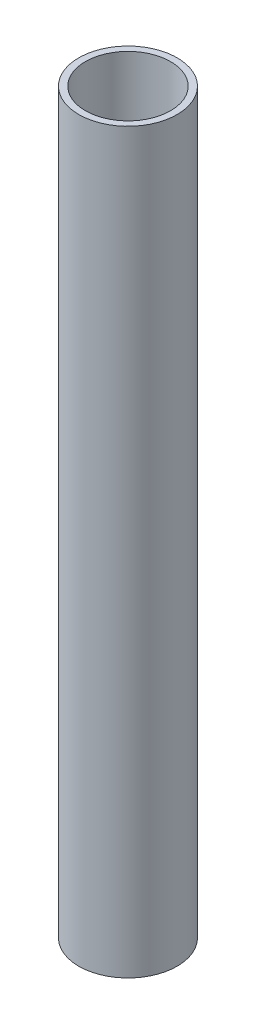
ISO-10303-21;
HEADER;
FILE_DESCRIPTION(('STEP AP214'),'2;1');
FILE_NAME('part.step','',(''),(''),'','','');
FILE_SCHEMA(('AUTOMOTIVE_DESIGN { 1 0 10303 214 1 1 1 1 }'));
ENDSEC;
DATA;
#1=APPLICATION_CONTEXT('core data for automotive mechanical design processes');
#2=APPLICATION_PROTOCOL_DEFINITION('international standard','automotive_design',2000,#1);
#3=PRODUCT_CONTEXT('',#1,'mechanical');
#4=PRODUCT('Part','Part','',(#3));
#5=PRODUCT_RELATED_PRODUCT_CATEGORY('part','',(#4));
#6=PRODUCT_DEFINITION_FORMATION('','',#4);
#7=PRODUCT_DEFINITION_CONTEXT('part definition',#1,'design');
#8=PRODUCT_DEFINITION('design','',#6,#7);
#9=PRODUCT_DEFINITION_SHAPE('','',#8);
#10=(LENGTH_UNIT() NAMED_UNIT(*) SI_UNIT(.MILLI.,.METRE.));
#11=(NAMED_UNIT(*) PLANE_ANGLE_UNIT() SI_UNIT($,.RADIAN.));
#12=(NAMED_UNIT(*) SI_UNIT($,.STERADIAN.) SOLID_ANGLE_UNIT());
#13=UNCERTAINTY_MEASURE_WITH_UNIT(LENGTH_MEASURE(1.E-05),#10,'distance_accuracy_value','');
#14=(GEOMETRIC_REPRESENTATION_CONTEXT(3) GLOBAL_UNCERTAINTY_ASSIGNED_CONTEXT((#13)) GLOBAL_UNIT_ASSIGNED_CONTEXT((#10,
#11,#12)) REPRESENTATION_CONTEXT('',''));
#15=CARTESIAN_POINT('',(0.,0.,0.));
#16=DIRECTION('',(0.,0.,1.));
#17=DIRECTION('',(1.,0.,0.));
#18=AXIS2_PLACEMENT_3D('',#15,#16,#17);
#19=CARTESIAN_POINT('',(0.,30.,0.));
#20=DIRECTION('',(0.,-1.,0.));
#21=DIRECTION('',(0.,0.,-1.));
#22=AXIS2_PLACEMENT_3D('',#19,#20,#21);
#23=CYLINDRICAL_SURFACE('',#22,2.);
#24=CARTESIAN_POINT('',(0.,30.,0.));
#25=DIRECTION('',(0.,1.,0.));
#26=DIRECTION('',(0.,0.,1.));
#27=AXIS2_PLACEMENT_3D('',#24,#25,#26);
#28=CIRCLE('',#27,2.);
#29=CARTESIAN_POINT('',(0.,30.,2.));
#30=VERTEX_POINT('',#29);
#31=EDGE_CURVE('E10',#30,#30,#28,.T.);
#32=ORIENTED_EDGE('',*,*,#31,.F.);
#33=EDGE_LOOP('',(#32));
#34=FACE_BOUND('',#33,.T.);
#35=CARTESIAN_POINT('',(0.,0.,0.));
#36=DIRECTION('',(0.,1.,0.));
#37=DIRECTION('',(0.,0.,1.));
#38=AXIS2_PLACEMENT_3D('',#35,#36,#37);
#39=CIRCLE('',#38,2.);
#40=CARTESIAN_POINT('',(0.,0.,2.));
#41=VERTEX_POINT('',#40);
#42=EDGE_CURVE('E40',#41,#41,#39,.T.);
#43=ORIENTED_EDGE('',*,*,#42,.T.);
#44=EDGE_LOOP('',(#43));
#45=FACE_BOUND('',#44,.T.);
#46=ADVANCED_FACE('F37',(#34,#45),#23,.T.);
#47=CARTESIAN_POINT('',(0.,30.,0.));
#48=DIRECTION('',(0.,1.,0.));
#49=DIRECTION('',(0.,0.,1.));
#50=AXIS2_PLACEMENT_3D('',#47,#48,#49);
#51=PLANE('',#50);
#52=CARTESIAN_POINT('',(0.,30.,0.));
#53=DIRECTION('',(0.,1.,0.));
#54=DIRECTION('',(0.,0.,1.));
#55=AXIS2_PLACEMENT_3D('',#52,#53,#54);
#56=CIRCLE('',#55,1.7325489537825);
#57=CARTESIAN_POINT('',(0.,30.,1.7325489537825));
#58=VERTEX_POINT('',#57);
#59=EDGE_CURVE('E51',#58,#58,#56,.T.);
#60=ORIENTED_EDGE('',*,*,#59,.F.);
#61=EDGE_LOOP('',(#60));
#62=FACE_BOUND('',#61,.T.);
#63=ORIENTED_EDGE('',*,*,#31,.T.);
#64=EDGE_LOOP('',(#63));
#65=FACE_BOUND('',#64,.T.);
#66=ADVANCED_FACE('F68',(#62,#65),#51,.T.);
#67=CARTESIAN_POINT('',(0.,0.,0.));
#68=DIRECTION('',(0.,1.,0.));
#69=DIRECTION('',(0.,0.,1.));
#70=AXIS2_PLACEMENT_3D('',#67,#68,#69);
#71=PLANE('',#70);
#72=CARTESIAN_POINT('',(0.,0.,0.));
#73=DIRECTION('',(0.,1.,0.));
#74=DIRECTION('',(0.,0.,1.));
#75=AXIS2_PLACEMENT_3D('',#72,#73,#74);
#76=CIRCLE('',#75,1.7325489537825);
#77=CARTESIAN_POINT('',(0.,0.,1.7325489537825));
#78=VERTEX_POINT('',#77);
#79=EDGE_CURVE('E49',#78,#78,#76,.T.);
#80=ORIENTED_EDGE('',*,*,#79,.T.);
#81=EDGE_LOOP('',(#80));
#82=FACE_BOUND('',#81,.T.);
#83=ORIENTED_EDGE('',*,*,#42,.F.);
#84=EDGE_LOOP('',(#83));
#85=FACE_BOUND('',#84,.T.);
#86=ADVANCED_FACE('F59',(#82,#85),#71,.F.);
#87=CARTESIAN_POINT('',(0.,0.,0.));
#88=DIRECTION('',(0.,1.,0.));
#89=DIRECTION('',(0.,0.,1.));
#90=AXIS2_PLACEMENT_3D('',#87,#88,#89);
#91=CYLINDRICAL_SURFACE('',#90,1.7325489537825);
#92=ORIENTED_EDGE('',*,*,#79,.F.);
#93=EDGE_LOOP('',(#92));
#94=FACE_BOUND('',#93,.T.);
#95=ORIENTED_EDGE('',*,*,#59,.T.);
#96=EDGE_LOOP('',(#95));
#97=FACE_BOUND('',#96,.T.);
#98=ADVANCED_FACE('F62',(#94,#97),#91,.F.);
#99=CLOSED_SHELL('',(#46,#66,#86,#98));
#100=MANIFOLD_SOLID_BREP('B2',#99);
#101=ADVANCED_BREP_SHAPE_REPRESENTATION('',(#18,#100),#14);
#102=SHAPE_DEFINITION_REPRESENTATION(#9,#101);
ENDSEC;
END-ISO-10303-21;
